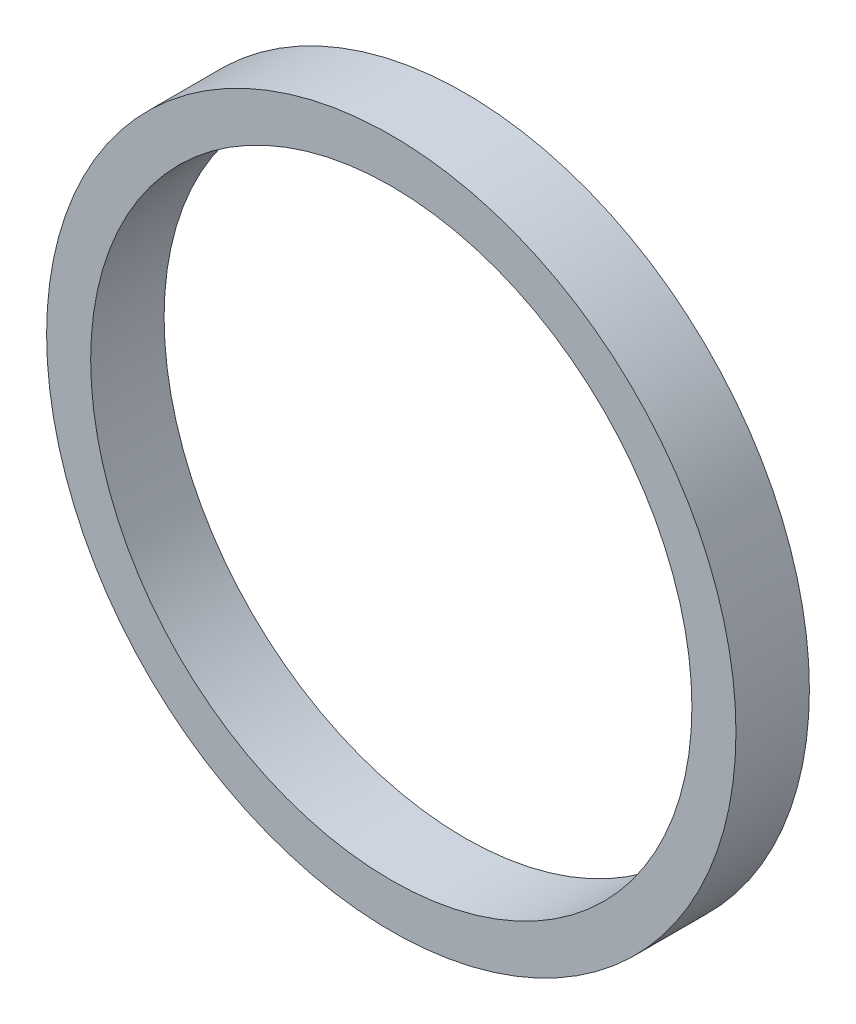
ISO-10303-21;
HEADER;
FILE_DESCRIPTION(('STEP AP214'),'2;1');
FILE_NAME('part.step','',(''),(''),'','','');
FILE_SCHEMA(('AUTOMOTIVE_DESIGN { 1 0 10303 214 1 1 1 1 }'));
ENDSEC;
DATA;
#1=APPLICATION_CONTEXT('core data for automotive mechanical design processes');
#2=APPLICATION_PROTOCOL_DEFINITION('international standard','automotive_design',2000,#1);
#3=PRODUCT_CONTEXT('',#1,'mechanical');
#4=PRODUCT('Part','Part','',(#3));
#5=PRODUCT_RELATED_PRODUCT_CATEGORY('part','',(#4));
#6=PRODUCT_DEFINITION_FORMATION('','',#4);
#7=PRODUCT_DEFINITION_CONTEXT('part definition',#1,'design');
#8=PRODUCT_DEFINITION('design','',#6,#7);
#9=PRODUCT_DEFINITION_SHAPE('','',#8);
#10=(LENGTH_UNIT() NAMED_UNIT(*) SI_UNIT(.MILLI.,.METRE.));
#11=(NAMED_UNIT(*) PLANE_ANGLE_UNIT() SI_UNIT($,.RADIAN.));
#12=(NAMED_UNIT(*) SI_UNIT($,.STERADIAN.) SOLID_ANGLE_UNIT());
#13=UNCERTAINTY_MEASURE_WITH_UNIT(LENGTH_MEASURE(1.E-05),#10,'distance_accuracy_value','');
#14=(GEOMETRIC_REPRESENTATION_CONTEXT(3) GLOBAL_UNCERTAINTY_ASSIGNED_CONTEXT((#13)) GLOBAL_UNIT_ASSIGNED_CONTEXT((#10,
#11,#12)) REPRESENTATION_CONTEXT('',''));
#15=CARTESIAN_POINT('',(0.,0.,0.));
#16=DIRECTION('',(0.,0.,1.));
#17=DIRECTION('',(1.,0.,0.));
#18=AXIS2_PLACEMENT_3D('',#15,#16,#17);
#19=CARTESIAN_POINT('',(0.,0.,8.));
#20=DIRECTION('',(0.,0.,1.));
#21=DIRECTION('',(1.,0.,0.));
#22=AXIS2_PLACEMENT_3D('',#19,#20,#21);
#23=PLANE('',#22);
#24=CARTESIAN_POINT('',(0.,0.,8.));
#25=DIRECTION('',(0.,0.,1.));
#26=DIRECTION('',(1.,0.,0.));
#27=AXIS2_PLACEMENT_3D('',#24,#25,#26);
#28=CIRCLE('',#27,37.55);
#29=CARTESIAN_POINT('',(37.55,0.,8.));
#30=VERTEX_POINT('',#29);
#31=EDGE_CURVE('E11',#30,#30,#28,.T.);
#32=ORIENTED_EDGE('',*,*,#31,.T.);
#33=EDGE_LOOP('',(#32));
#34=FACE_BOUND('',#33,.T.);
#35=CARTESIAN_POINT('',(0.,0.,8.));
#36=DIRECTION('',(0.,0.,1.));
#37=DIRECTION('',(1.,0.,0.));
#38=AXIS2_PLACEMENT_3D('',#35,#36,#37);
#39=CIRCLE('',#38,32.75);
#40=CARTESIAN_POINT('',(32.75,0.,8.));
#41=VERTEX_POINT('',#40);
#42=EDGE_CURVE('E54',#41,#41,#39,.T.);
#43=ORIENTED_EDGE('',*,*,#42,.F.);
#44=EDGE_LOOP('',(#43));
#45=FACE_BOUND('',#44,.T.);
#46=ADVANCED_FACE('F43',(#34,#45),#23,.T.);
#47=CARTESIAN_POINT('',(0.,0.,0.));
#48=DIRECTION('',(0.,0.,1.));
#49=DIRECTION('',(1.,0.,0.));
#50=AXIS2_PLACEMENT_3D('',#47,#48,#49);
#51=PLANE('',#50);
#52=CARTESIAN_POINT('',(0.,0.,0.));
#53=DIRECTION('',(0.,0.,1.));
#54=DIRECTION('',(1.,0.,0.));
#55=AXIS2_PLACEMENT_3D('',#52,#53,#54);
#56=CIRCLE('',#55,37.55);
#57=CARTESIAN_POINT('',(37.55,0.,0.));
#58=VERTEX_POINT('',#57);
#59=EDGE_CURVE('E47',#58,#58,#56,.T.);
#60=ORIENTED_EDGE('',*,*,#59,.F.);
#61=EDGE_LOOP('',(#60));
#62=FACE_BOUND('',#61,.T.);
#63=CARTESIAN_POINT('',(0.,0.,0.));
#64=DIRECTION('',(0.,0.,1.));
#65=DIRECTION('',(1.,0.,0.));
#66=AXIS2_PLACEMENT_3D('',#63,#64,#65);
#67=CIRCLE('',#66,32.75);
#68=CARTESIAN_POINT('',(32.75,0.,0.));
#69=VERTEX_POINT('',#68);
#70=EDGE_CURVE('E56',#69,#69,#67,.T.);
#71=ORIENTED_EDGE('',*,*,#70,.T.);
#72=EDGE_LOOP('',(#71));
#73=FACE_BOUND('',#72,.T.);
#74=ADVANCED_FACE('F66',(#62,#73),#51,.F.);
#75=CARTESIAN_POINT('',(0.,0.,8.));
#76=DIRECTION('',(0.,0.,-1.));
#77=DIRECTION('',(-1.,0.,0.));
#78=AXIS2_PLACEMENT_3D('',#75,#76,#77);
#79=CYLINDRICAL_SURFACE('',#78,37.55);
#80=ORIENTED_EDGE('',*,*,#31,.F.);
#81=EDGE_LOOP('',(#80));
#82=FACE_BOUND('',#81,.T.);
#83=ORIENTED_EDGE('',*,*,#59,.T.);
#84=EDGE_LOOP('',(#83));
#85=FACE_BOUND('',#84,.T.);
#86=ADVANCED_FACE('F45',(#82,#85),#79,.T.);
#87=CARTESIAN_POINT('',(0.,0.,8.));
#88=DIRECTION('',(0.,0.,-1.));
#89=DIRECTION('',(-1.,0.,0.));
#90=AXIS2_PLACEMENT_3D('',#87,#88,#89);
#91=CYLINDRICAL_SURFACE('',#90,32.75);
#92=ORIENTED_EDGE('',*,*,#42,.T.);
#93=EDGE_LOOP('',(#92));
#94=FACE_BOUND('',#93,.T.);
#95=ORIENTED_EDGE('',*,*,#70,.F.);
#96=EDGE_LOOP('',(#95));
#97=FACE_BOUND('',#96,.T.);
#98=ADVANCED_FACE('F62',(#94,#97),#91,.F.);
#99=CLOSED_SHELL('',(#46,#74,#86,#98));
#100=MANIFOLD_SOLID_BREP('B2',#99);
#101=ADVANCED_BREP_SHAPE_REPRESENTATION('',(#18,#100),#14);
#102=SHAPE_DEFINITION_REPRESENTATION(#9,#101);
ENDSEC;
END-ISO-10303-21;
